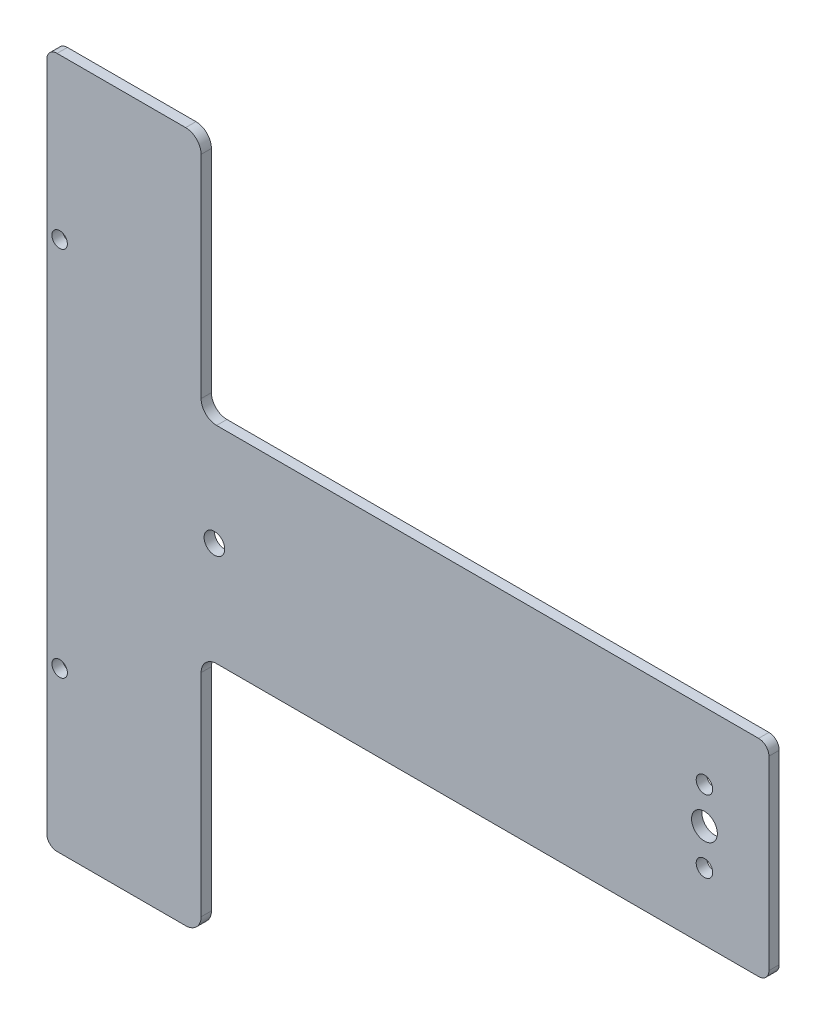
ISO-10303-21;
HEADER;
FILE_DESCRIPTION(('STEP AP214'),'2;1');
FILE_NAME('part.step','',(''),(''),'','','');
FILE_SCHEMA(('AUTOMOTIVE_DESIGN { 1 0 10303 214 1 1 1 1 }'));
ENDSEC;
DATA;
#1=APPLICATION_CONTEXT('core data for automotive mechanical design processes');
#2=APPLICATION_PROTOCOL_DEFINITION('international standard','automotive_design',2000,#1);
#3=PRODUCT_CONTEXT('',#1,'mechanical');
#4=PRODUCT('Part','Part','',(#3));
#5=PRODUCT_RELATED_PRODUCT_CATEGORY('part','',(#4));
#6=PRODUCT_DEFINITION_FORMATION('','',#4);
#7=PRODUCT_DEFINITION_CONTEXT('part definition',#1,'design');
#8=PRODUCT_DEFINITION('design','',#6,#7);
#9=PRODUCT_DEFINITION_SHAPE('','',#8);
#10=(LENGTH_UNIT() NAMED_UNIT(*) SI_UNIT(.MILLI.,.METRE.));
#11=(NAMED_UNIT(*) PLANE_ANGLE_UNIT() SI_UNIT($,.RADIAN.));
#12=(NAMED_UNIT(*) SI_UNIT($,.STERADIAN.) SOLID_ANGLE_UNIT());
#13=UNCERTAINTY_MEASURE_WITH_UNIT(LENGTH_MEASURE(1.E-05),#10,'distance_accuracy_value','');
#14=(GEOMETRIC_REPRESENTATION_CONTEXT(3) GLOBAL_UNCERTAINTY_ASSIGNED_CONTEXT((#13)) GLOBAL_UNIT_ASSIGNED_CONTEXT((#10,
#11,#12)) REPRESENTATION_CONTEXT('',''));
#15=CARTESIAN_POINT('',(0.,0.,0.));
#16=DIRECTION('',(0.,0.,1.));
#17=DIRECTION('',(1.,0.,0.));
#18=AXIS2_PLACEMENT_3D('',#15,#16,#17);
#19=CARTESIAN_POINT('',(84.0783787460964,65.,47.6560709105095));
#20=DIRECTION('',(0.,0.,-1.));
#21=DIRECTION('',(-1.,0.,0.));
#22=AXIS2_PLACEMENT_3D('',#19,#20,#21);
#23=CYLINDRICAL_SURFACE('',#22,2.);
#24=CARTESIAN_POINT('',(84.0783787460964,65.,45.6560709105095));
#25=DIRECTION('',(0.,0.,1.));
#26=DIRECTION('',(1.,0.,0.));
#27=AXIS2_PLACEMENT_3D('',#24,#25,#26);
#28=CIRCLE('',#27,2.);
#29=CARTESIAN_POINT('',(84.0783787460964,67.,45.6560709105095));
#30=VERTEX_POINT('',#29);
#31=CARTESIAN_POINT('',(82.0783787460964,65.,45.6560709105095));
#32=VERTEX_POINT('',#31);
#33=EDGE_CURVE('E198',#30,#32,#28,.T.);
#34=ORIENTED_EDGE('',*,*,#33,.T.);
#35=DIRECTION('',(0.,0.,-1.));
#36=VECTOR('',#35,1.);
#37=CARTESIAN_POINT('',(82.0783787460964,65.,47.6560709105095));
#38=LINE('',#37,#36);
#39=CARTESIAN_POINT('',(82.0783787460964,65.,47.6560709105095));
#40=VERTEX_POINT('',#39);
#41=EDGE_CURVE('E11',#40,#32,#38,.T.);
#42=ORIENTED_EDGE('',*,*,#41,.F.);
#43=CARTESIAN_POINT('',(84.0783787460964,65.,47.6560709105095));
#44=DIRECTION('',(0.,0.,1.));
#45=DIRECTION('',(1.,0.,0.));
#46=AXIS2_PLACEMENT_3D('',#43,#44,#45);
#47=CIRCLE('',#46,2.);
#48=CARTESIAN_POINT('',(84.0783787460964,67.,47.6560709105095));
#49=VERTEX_POINT('',#48);
#50=EDGE_CURVE('E245',#49,#40,#47,.T.);
#51=ORIENTED_EDGE('',*,*,#50,.F.);
#52=DIRECTION('',(0.,0.,-1.));
#53=VECTOR('',#52,1.);
#54=CARTESIAN_POINT('',(84.0783787460964,67.,47.6560709105095));
#55=LINE('',#54,#53);
#56=EDGE_CURVE('E194',#49,#30,#55,.T.);
#57=ORIENTED_EDGE('',*,*,#56,.T.);
#58=EDGE_LOOP('',(#34,#42,#51,#57));
#59=FACE_BOUND('',#58,.T.);
#60=ADVANCED_FACE('F47',(#59),#23,.T.);
#61=CARTESIAN_POINT('',(82.0783787460964,65.,47.6560709105095));
#62=DIRECTION('',(1.,0.,0.));
#63=DIRECTION('',(0.,0.,-1.));
#64=AXIS2_PLACEMENT_3D('',#61,#62,#63);
#65=PLANE('',#64);
#66=DIRECTION('',(0.,-1.,0.));
#67=VECTOR('',#66,1.);
#68=CARTESIAN_POINT('',(82.0783787460964,65.,45.6560709105095));
#69=LINE('',#68,#67);
#70=CARTESIAN_POINT('',(82.0783787460964,-65.,45.6560709105095));
#71=VERTEX_POINT('',#70);
#72=EDGE_CURVE('E202',#32,#71,#69,.T.);
#73=ORIENTED_EDGE('',*,*,#72,.T.);
#74=DIRECTION('',(0.,0.,-1.));
#75=VECTOR('',#74,1.);
#76=CARTESIAN_POINT('',(82.0783787460964,-65.,47.6560709105095));
#77=LINE('',#76,#75);
#78=CARTESIAN_POINT('',(82.0783787460964,-65.,47.6560709105095));
#79=VERTEX_POINT('',#78);
#80=EDGE_CURVE('E56',#79,#71,#77,.T.);
#81=ORIENTED_EDGE('',*,*,#80,.F.);
#82=DIRECTION('',(0.,-1.,0.));
#83=VECTOR('',#82,1.);
#84=CARTESIAN_POINT('',(82.0783787460964,65.,47.6560709105095));
#85=LINE('',#84,#83);
#86=EDGE_CURVE('E131',#40,#79,#85,.T.);
#87=ORIENTED_EDGE('',*,*,#86,.F.);
#88=ORIENTED_EDGE('',*,*,#41,.T.);
#89=EDGE_LOOP('',(#73,#81,#87,#88));
#90=FACE_BOUND('',#89,.T.);
#91=ADVANCED_FACE('F394',(#90),#65,.F.);
#92=CARTESIAN_POINT('',(84.0783787460964,-65.,47.6560709105095));
#93=DIRECTION('',(0.,0.,-1.));
#94=DIRECTION('',(-1.,0.,0.));
#95=AXIS2_PLACEMENT_3D('',#92,#93,#94);
#96=CYLINDRICAL_SURFACE('',#95,2.);
#97=CARTESIAN_POINT('',(84.0783787460964,-65.,45.6560709105095));
#98=DIRECTION('',(0.,0.,1.));
#99=DIRECTION('',(1.,0.,0.));
#100=AXIS2_PLACEMENT_3D('',#97,#98,#99);
#101=CIRCLE('',#100,2.);
#102=CARTESIAN_POINT('',(84.0783787460964,-67.,45.6560709105095));
#103=VERTEX_POINT('',#102);
#104=EDGE_CURVE('E206',#71,#103,#101,.T.);
#105=ORIENTED_EDGE('',*,*,#104,.T.);
#106=DIRECTION('',(0.,0.,-1.));
#107=VECTOR('',#106,1.);
#108=CARTESIAN_POINT('',(84.0783787460964,-67.,47.6560709105095));
#109=LINE('',#108,#107);
#110=CARTESIAN_POINT('',(84.0783787460964,-67.,47.6560709105095));
#111=VERTEX_POINT('',#110);
#112=EDGE_CURVE('E288',#111,#103,#109,.T.);
#113=ORIENTED_EDGE('',*,*,#112,.F.);
#114=CARTESIAN_POINT('',(84.0783787460964,-65.,47.6560709105095));
#115=DIRECTION('',(0.,0.,1.));
#116=DIRECTION('',(1.,0.,0.));
#117=AXIS2_PLACEMENT_3D('',#114,#115,#116);
#118=CIRCLE('',#117,2.);
#119=EDGE_CURVE('E300',#79,#111,#118,.T.);
#120=ORIENTED_EDGE('',*,*,#119,.F.);
#121=ORIENTED_EDGE('',*,*,#80,.T.);
#122=EDGE_LOOP('',(#105,#113,#120,#121));
#123=FACE_BOUND('',#122,.T.);
#124=ADVANCED_FACE('F298',(#123),#96,.T.);
#125=CARTESIAN_POINT('',(84.0783787460964,-67.,47.6560709105095));
#126=DIRECTION('',(0.,1.,0.));
#127=DIRECTION('',(0.,0.,1.));
#128=AXIS2_PLACEMENT_3D('',#125,#126,#127);
#129=PLANE('',#128);
#130=DIRECTION('',(1.,0.,0.));
#131=VECTOR('',#130,1.);
#132=CARTESIAN_POINT('',(84.0783787460964,-67.,45.6560709105095));
#133=LINE('',#132,#131);
#134=CARTESIAN_POINT('',(109.,-67.,45.6560709105095));
#135=VERTEX_POINT('',#134);
#136=EDGE_CURVE('E209',#103,#135,#133,.T.);
#137=ORIENTED_EDGE('',*,*,#136,.T.);
#138=DIRECTION('',(0.,0.,-1.));
#139=VECTOR('',#138,1.);
#140=CARTESIAN_POINT('',(109.,-67.,47.6560709105095));
#141=LINE('',#140,#139);
#142=CARTESIAN_POINT('',(109.,-67.,47.6560709105095));
#143=VERTEX_POINT('',#142);
#144=EDGE_CURVE('E284',#143,#135,#141,.T.);
#145=ORIENTED_EDGE('',*,*,#144,.F.);
#146=DIRECTION('',(1.,0.,0.));
#147=VECTOR('',#146,1.);
#148=CARTESIAN_POINT('',(84.0783787460964,-67.,47.6560709105095));
#149=LINE('',#148,#147);
#150=EDGE_CURVE('E319',#111,#143,#149,.T.);
#151=ORIENTED_EDGE('',*,*,#150,.F.);
#152=ORIENTED_EDGE('',*,*,#112,.T.);
#153=EDGE_LOOP('',(#137,#145,#151,#152));
#154=FACE_BOUND('',#153,.T.);
#155=ADVANCED_FACE('F309',(#154),#129,.F.);
#156=CARTESIAN_POINT('',(109.,-64.,47.6560709105095));
#157=DIRECTION('',(0.,0.,-1.));
#158=DIRECTION('',(-1.,0.,0.));
#159=AXIS2_PLACEMENT_3D('',#156,#157,#158);
#160=CYLINDRICAL_SURFACE('',#159,3.);
#161=CARTESIAN_POINT('',(109.,-64.,45.6560709105095));
#162=DIRECTION('',(0.,0.,1.));
#163=DIRECTION('',(1.,0.,0.));
#164=AXIS2_PLACEMENT_3D('',#161,#162,#163);
#165=CIRCLE('',#164,3.);
#166=CARTESIAN_POINT('',(112.,-64.,45.6560709105095));
#167=VERTEX_POINT('',#166);
#168=EDGE_CURVE('E212',#135,#167,#165,.T.);
#169=ORIENTED_EDGE('',*,*,#168,.T.);
#170=DIRECTION('',(0.,0.,-1.));
#171=VECTOR('',#170,1.);
#172=CARTESIAN_POINT('',(112.,-64.,47.6560709105095));
#173=LINE('',#172,#171);
#174=CARTESIAN_POINT('',(112.,-64.,47.6560709105095));
#175=VERTEX_POINT('',#174);
#176=EDGE_CURVE('E280',#175,#167,#173,.T.);
#177=ORIENTED_EDGE('',*,*,#176,.F.);
#178=CARTESIAN_POINT('',(109.,-64.,47.6560709105095));
#179=DIRECTION('',(0.,0.,1.));
#180=DIRECTION('',(1.,0.,0.));
#181=AXIS2_PLACEMENT_3D('',#178,#179,#180);
#182=CIRCLE('',#181,3.);
#183=EDGE_CURVE('E315',#143,#175,#182,.T.);
#184=ORIENTED_EDGE('',*,*,#183,.F.);
#185=ORIENTED_EDGE('',*,*,#144,.T.);
#186=EDGE_LOOP('',(#169,#177,#184,#185));
#187=FACE_BOUND('',#186,.T.);
#188=ADVANCED_FACE('F313',(#187),#160,.T.);
#189=CARTESIAN_POINT('',(112.,-64.,47.6560709105095));
#190=DIRECTION('',(-1.,0.,0.));
#191=DIRECTION('',(0.,0.,1.));
#192=AXIS2_PLACEMENT_3D('',#189,#190,#191);
#193=PLANE('',#192);
#194=DIRECTION('',(0.,1.,0.));
#195=VECTOR('',#194,1.);
#196=CARTESIAN_POINT('',(112.,-64.,45.6560709105095));
#197=LINE('',#196,#195);
#198=CARTESIAN_POINT('',(112.,-23.,45.6560709105095));
#199=VERTEX_POINT('',#198);
#200=EDGE_CURVE('E215',#167,#199,#197,.T.);
#201=ORIENTED_EDGE('',*,*,#200,.T.);
#202=DIRECTION('',(0.,0.,-1.));
#203=VECTOR('',#202,1.);
#204=CARTESIAN_POINT('',(112.,-23.,47.6560709105095));
#205=LINE('',#204,#203);
#206=CARTESIAN_POINT('',(112.,-23.,47.6560709105095));
#207=VERTEX_POINT('',#206);
#208=EDGE_CURVE('E276',#207,#199,#205,.T.);
#209=ORIENTED_EDGE('',*,*,#208,.F.);
#210=DIRECTION('',(0.,1.,0.));
#211=VECTOR('',#210,1.);
#212=CARTESIAN_POINT('',(112.,-64.,47.6560709105095));
#213=LINE('',#212,#211);
#214=EDGE_CURVE('E318',#175,#207,#213,.T.);
#215=ORIENTED_EDGE('',*,*,#214,.F.);
#216=ORIENTED_EDGE('',*,*,#176,.T.);
#217=EDGE_LOOP('',(#201,#209,#215,#216));
#218=FACE_BOUND('',#217,.T.);
#219=ADVANCED_FACE('F405',(#218),#193,.F.);
#220=CARTESIAN_POINT('',(115.,-23.,47.6560709105095));
#221=DIRECTION('',(0.,0.,-1.));
#222=DIRECTION('',(-1.,0.,0.));
#223=AXIS2_PLACEMENT_3D('',#220,#221,#222);
#224=CYLINDRICAL_SURFACE('',#223,3.);
#225=CARTESIAN_POINT('',(115.,-23.,45.6560709105095));
#226=DIRECTION('',(0.,0.,-1.));
#227=DIRECTION('',(-1.,0.,0.));
#228=AXIS2_PLACEMENT_3D('',#225,#226,#227);
#229=CIRCLE('',#228,3.);
#230=CARTESIAN_POINT('',(115.,-20.,45.6560709105095));
#231=VERTEX_POINT('',#230);
#232=EDGE_CURVE('E218',#199,#231,#229,.T.);
#233=ORIENTED_EDGE('',*,*,#232,.T.);
#234=DIRECTION('',(0.,0.,-1.));
#235=VECTOR('',#234,1.);
#236=CARTESIAN_POINT('',(115.,-20.,47.6560709105095));
#237=LINE('',#236,#235);
#238=CARTESIAN_POINT('',(115.,-20.,47.6560709105095));
#239=VERTEX_POINT('',#238);
#240=EDGE_CURVE('E272',#239,#231,#237,.T.);
#241=ORIENTED_EDGE('',*,*,#240,.F.);
#242=CARTESIAN_POINT('',(115.,-23.,47.6560709105095));
#243=DIRECTION('',(0.,0.,-1.));
#244=DIRECTION('',(-1.,0.,0.));
#245=AXIS2_PLACEMENT_3D('',#242,#243,#244);
#246=CIRCLE('',#245,3.);
#247=EDGE_CURVE('E322',#207,#239,#246,.T.);
#248=ORIENTED_EDGE('',*,*,#247,.F.);
#249=ORIENTED_EDGE('',*,*,#208,.T.);
#250=EDGE_LOOP('',(#233,#241,#248,#249));
#251=FACE_BOUND('',#250,.T.);
#252=ADVANCED_FACE('F408',(#251),#224,.F.);
#253=CARTESIAN_POINT('',(115.,-20.,47.6560709105095));
#254=DIRECTION('',(0.,1.,0.));
#255=DIRECTION('',(0.,0.,1.));
#256=AXIS2_PLACEMENT_3D('',#253,#254,#255);
#257=PLANE('',#256);
#258=DIRECTION('',(1.,0.,0.));
#259=VECTOR('',#258,1.);
#260=CARTESIAN_POINT('',(115.,-20.,45.6560709105095));
#261=LINE('',#260,#259);
#262=CARTESIAN_POINT('',(220.078378746096,-20.,45.6560709105095));
#263=VERTEX_POINT('',#262);
#264=EDGE_CURVE('E221',#231,#263,#261,.T.);
#265=ORIENTED_EDGE('',*,*,#264,.T.);
#266=DIRECTION('',(0.,0.,-1.));
#267=VECTOR('',#266,1.);
#268=CARTESIAN_POINT('',(220.078378746096,-20.,47.6560709105095));
#269=LINE('',#268,#267);
#270=CARTESIAN_POINT('',(220.078378746096,-20.,47.6560709105095));
#271=VERTEX_POINT('',#270);
#272=EDGE_CURVE('E268',#271,#263,#269,.T.);
#273=ORIENTED_EDGE('',*,*,#272,.F.);
#274=DIRECTION('',(1.,0.,0.));
#275=VECTOR('',#274,1.);
#276=CARTESIAN_POINT('',(115.,-20.,47.6560709105095));
#277=LINE('',#276,#275);
#278=EDGE_CURVE('E330',#239,#271,#277,.T.);
#279=ORIENTED_EDGE('',*,*,#278,.F.);
#280=ORIENTED_EDGE('',*,*,#240,.T.);
#281=EDGE_LOOP('',(#265,#273,#279,#280));
#282=FACE_BOUND('',#281,.T.);
#283=ADVANCED_FACE('F412',(#282),#257,.F.);
#284=CARTESIAN_POINT('',(220.078378746096,-18.,47.6560709105095));
#285=DIRECTION('',(0.,0.,-1.));
#286=DIRECTION('',(-1.,0.,0.));
#287=AXIS2_PLACEMENT_3D('',#284,#285,#286);
#288=CYLINDRICAL_SURFACE('',#287,2.);
#289=CARTESIAN_POINT('',(220.078378746096,-18.,45.6560709105095));
#290=DIRECTION('',(0.,0.,1.));
#291=DIRECTION('',(1.,0.,0.));
#292=AXIS2_PLACEMENT_3D('',#289,#290,#291);
#293=CIRCLE('',#292,2.);
#294=CARTESIAN_POINT('',(222.078378746096,-18.,45.6560709105095));
#295=VERTEX_POINT('',#294);
#296=EDGE_CURVE('E224',#263,#295,#293,.T.);
#297=ORIENTED_EDGE('',*,*,#296,.T.);
#298=DIRECTION('',(0.,0.,-1.));
#299=VECTOR('',#298,1.);
#300=CARTESIAN_POINT('',(222.078378746096,-18.,47.6560709105095));
#301=LINE('',#300,#299);
#302=CARTESIAN_POINT('',(222.078378746096,-18.,47.6560709105095));
#303=VERTEX_POINT('',#302);
#304=EDGE_CURVE('E264',#303,#295,#301,.T.);
#305=ORIENTED_EDGE('',*,*,#304,.F.);
#306=CARTESIAN_POINT('',(220.078378746096,-18.,47.6560709105095));
#307=DIRECTION('',(0.,0.,1.));
#308=DIRECTION('',(1.,0.,0.));
#309=AXIS2_PLACEMENT_3D('',#306,#307,#308);
#310=CIRCLE('',#309,2.);
#311=EDGE_CURVE('E332',#271,#303,#310,.T.);
#312=ORIENTED_EDGE('',*,*,#311,.F.);
#313=ORIENTED_EDGE('',*,*,#272,.T.);
#314=EDGE_LOOP('',(#297,#305,#312,#313));
#315=FACE_BOUND('',#314,.T.);
#316=ADVANCED_FACE('F416',(#315),#288,.T.);
#317=CARTESIAN_POINT('',(222.078378746096,-18.,47.6560709105095));
#318=DIRECTION('',(-1.,0.,0.));
#319=DIRECTION('',(0.,0.,1.));
#320=AXIS2_PLACEMENT_3D('',#317,#318,#319);
#321=PLANE('',#320);
#322=DIRECTION('',(0.,1.,0.));
#323=VECTOR('',#322,1.);
#324=CARTESIAN_POINT('',(222.078378746096,-18.,45.6560709105095));
#325=LINE('',#324,#323);
#326=CARTESIAN_POINT('',(222.078378746096,18.,45.6560709105095));
#327=VERTEX_POINT('',#326);
#328=EDGE_CURVE('E227',#295,#327,#325,.T.);
#329=ORIENTED_EDGE('',*,*,#328,.T.);
#330=DIRECTION('',(0.,0.,-1.));
#331=VECTOR('',#330,1.);
#332=CARTESIAN_POINT('',(222.078378746096,18.,47.6560709105095));
#333=LINE('',#332,#331);
#334=CARTESIAN_POINT('',(222.078378746096,18.,47.6560709105095));
#335=VERTEX_POINT('',#334);
#336=EDGE_CURVE('E260',#335,#327,#333,.T.);
#337=ORIENTED_EDGE('',*,*,#336,.F.);
#338=DIRECTION('',(0.,1.,0.));
#339=VECTOR('',#338,1.);
#340=CARTESIAN_POINT('',(222.078378746096,-18.,47.6560709105095));
#341=LINE('',#340,#339);
#342=EDGE_CURVE('E335',#303,#335,#341,.T.);
#343=ORIENTED_EDGE('',*,*,#342,.F.);
#344=ORIENTED_EDGE('',*,*,#304,.T.);
#345=EDGE_LOOP('',(#329,#337,#343,#344));
#346=FACE_BOUND('',#345,.T.);
#347=ADVANCED_FACE('F420',(#346),#321,.F.);
#348=CARTESIAN_POINT('',(220.078378746096,18.,47.6560709105095));
#349=DIRECTION('',(0.,0.,-1.));
#350=DIRECTION('',(-1.,0.,0.));
#351=AXIS2_PLACEMENT_3D('',#348,#349,#350);
#352=CYLINDRICAL_SURFACE('',#351,2.);
#353=CARTESIAN_POINT('',(220.078378746096,18.,45.6560709105095));
#354=DIRECTION('',(0.,0.,1.));
#355=DIRECTION('',(1.,0.,0.));
#356=AXIS2_PLACEMENT_3D('',#353,#354,#355);
#357=CIRCLE('',#356,2.);
#358=CARTESIAN_POINT('',(220.078378746096,20.,45.6560709105095));
#359=VERTEX_POINT('',#358);
#360=EDGE_CURVE('E230',#327,#359,#357,.T.);
#361=ORIENTED_EDGE('',*,*,#360,.T.);
#362=DIRECTION('',(0.,0.,-1.));
#363=VECTOR('',#362,1.);
#364=CARTESIAN_POINT('',(220.078378746096,20.,47.6560709105095));
#365=LINE('',#364,#363);
#366=CARTESIAN_POINT('',(220.078378746096,20.,47.6560709105095));
#367=VERTEX_POINT('',#366);
#368=EDGE_CURVE('E256',#367,#359,#365,.T.);
#369=ORIENTED_EDGE('',*,*,#368,.F.);
#370=CARTESIAN_POINT('',(220.078378746096,18.,47.6560709105095));
#371=DIRECTION('',(0.,0.,1.));
#372=DIRECTION('',(1.,0.,0.));
#373=AXIS2_PLACEMENT_3D('',#370,#371,#372);
#374=CIRCLE('',#373,2.);
#375=EDGE_CURVE('E338',#335,#367,#374,.T.);
#376=ORIENTED_EDGE('',*,*,#375,.F.);
#377=ORIENTED_EDGE('',*,*,#336,.T.);
#378=EDGE_LOOP('',(#361,#369,#376,#377));
#379=FACE_BOUND('',#378,.T.);
#380=ADVANCED_FACE('F424',(#379),#352,.T.);
#381=CARTESIAN_POINT('',(220.078378746096,20.,47.6560709105095));
#382=DIRECTION('',(0.,-1.,0.));
#383=DIRECTION('',(0.,0.,-1.));
#384=AXIS2_PLACEMENT_3D('',#381,#382,#383);
#385=PLANE('',#384);
#386=DIRECTION('',(-1.,0.,0.));
#387=VECTOR('',#386,1.);
#388=CARTESIAN_POINT('',(220.078378746096,20.,45.6560709105095));
#389=LINE('',#388,#387);
#390=CARTESIAN_POINT('',(115.,20.,45.6560709105095));
#391=VERTEX_POINT('',#390);
#392=EDGE_CURVE('E233',#359,#391,#389,.T.);
#393=ORIENTED_EDGE('',*,*,#392,.T.);
#394=DIRECTION('',(0.,0.,-1.));
#395=VECTOR('',#394,1.);
#396=CARTESIAN_POINT('',(115.,20.,47.6560709105095));
#397=LINE('',#396,#395);
#398=CARTESIAN_POINT('',(115.,20.,47.6560709105095));
#399=VERTEX_POINT('',#398);
#400=EDGE_CURVE('E252',#399,#391,#397,.T.);
#401=ORIENTED_EDGE('',*,*,#400,.F.);
#402=DIRECTION('',(-1.,0.,0.));
#403=VECTOR('',#402,1.);
#404=CARTESIAN_POINT('',(220.078378746096,20.,47.6560709105095));
#405=LINE('',#404,#403);
#406=EDGE_CURVE('E341',#367,#399,#405,.T.);
#407=ORIENTED_EDGE('',*,*,#406,.F.);
#408=ORIENTED_EDGE('',*,*,#368,.T.);
#409=EDGE_LOOP('',(#393,#401,#407,#408));
#410=FACE_BOUND('',#409,.T.);
#411=ADVANCED_FACE('F428',(#410),#385,.F.);
#412=CARTESIAN_POINT('',(115.,23.,47.6560709105095));
#413=DIRECTION('',(0.,0.,-1.));
#414=DIRECTION('',(-1.,0.,0.));
#415=AXIS2_PLACEMENT_3D('',#412,#413,#414);
#416=CYLINDRICAL_SURFACE('',#415,3.);
#417=CARTESIAN_POINT('',(115.,23.,45.6560709105095));
#418=DIRECTION('',(0.,0.,-1.));
#419=DIRECTION('',(-1.,0.,0.));
#420=AXIS2_PLACEMENT_3D('',#417,#418,#419);
#421=CIRCLE('',#420,3.);
#422=CARTESIAN_POINT('',(112.,23.,45.6560709105095));
#423=VERTEX_POINT('',#422);
#424=EDGE_CURVE('E236',#391,#423,#421,.T.);
#425=ORIENTED_EDGE('',*,*,#424,.T.);
#426=DIRECTION('',(0.,0.,-1.));
#427=VECTOR('',#426,1.);
#428=CARTESIAN_POINT('',(112.,23.,47.6560709105095));
#429=LINE('',#428,#427);
#430=CARTESIAN_POINT('',(112.,23.,47.6560709105095));
#431=VERTEX_POINT('',#430);
#432=EDGE_CURVE('E185',#431,#423,#429,.T.);
#433=ORIENTED_EDGE('',*,*,#432,.F.);
#434=CARTESIAN_POINT('',(115.,23.,47.6560709105095));
#435=DIRECTION('',(0.,0.,-1.));
#436=DIRECTION('',(-1.,0.,0.));
#437=AXIS2_PLACEMENT_3D('',#434,#435,#436);
#438=CIRCLE('',#437,3.);
#439=EDGE_CURVE('E174',#399,#431,#438,.T.);
#440=ORIENTED_EDGE('',*,*,#439,.F.);
#441=ORIENTED_EDGE('',*,*,#400,.T.);
#442=EDGE_LOOP('',(#425,#433,#440,#441));
#443=FACE_BOUND('',#442,.T.);
#444=ADVANCED_FACE('F432',(#443),#416,.F.);
#445=CARTESIAN_POINT('',(112.,23.,47.6560709105095));
#446=DIRECTION('',(-1.,0.,0.));
#447=DIRECTION('',(0.,0.,1.));
#448=AXIS2_PLACEMENT_3D('',#445,#446,#447);
#449=PLANE('',#448);
#450=DIRECTION('',(0.,1.,0.));
#451=VECTOR('',#450,1.);
#452=CARTESIAN_POINT('',(112.,23.,45.6560709105095));
#453=LINE('',#452,#451);
#454=CARTESIAN_POINT('',(112.,64.,45.6560709105095));
#455=VERTEX_POINT('',#454);
#456=EDGE_CURVE('E183',#423,#455,#453,.T.);
#457=ORIENTED_EDGE('',*,*,#456,.T.);
#458=DIRECTION('',(0.,0.,-1.));
#459=VECTOR('',#458,1.);
#460=CARTESIAN_POINT('',(112.,64.,47.6560709105095));
#461=LINE('',#460,#459);
#462=CARTESIAN_POINT('',(112.,64.,47.6560709105095));
#463=VERTEX_POINT('',#462);
#464=EDGE_CURVE('E180',#463,#455,#461,.T.);
#465=ORIENTED_EDGE('',*,*,#464,.F.);
#466=DIRECTION('',(0.,1.,0.));
#467=VECTOR('',#466,1.);
#468=CARTESIAN_POINT('',(112.,23.,47.6560709105095));
#469=LINE('',#468,#467);
#470=EDGE_CURVE('E168',#431,#463,#469,.T.);
#471=ORIENTED_EDGE('',*,*,#470,.F.);
#472=ORIENTED_EDGE('',*,*,#432,.T.);
#473=EDGE_LOOP('',(#457,#465,#471,#472));
#474=FACE_BOUND('',#473,.T.);
#475=ADVANCED_FACE('F181',(#474),#449,.F.);
#476=CARTESIAN_POINT('',(109.,64.,47.6560709105095));
#477=DIRECTION('',(0.,0.,-1.));
#478=DIRECTION('',(-1.,0.,0.));
#479=AXIS2_PLACEMENT_3D('',#476,#477,#478);
#480=CYLINDRICAL_SURFACE('',#479,3.);
#481=CARTESIAN_POINT('',(109.,64.,45.6560709105095));
#482=DIRECTION('',(0.,0.,1.));
#483=DIRECTION('',(1.,0.,0.));
#484=AXIS2_PLACEMENT_3D('',#481,#482,#483);
#485=CIRCLE('',#484,3.);
#486=CARTESIAN_POINT('',(109.,67.,45.6560709105095));
#487=VERTEX_POINT('',#486);
#488=EDGE_CURVE('E117',#455,#487,#485,.T.);
#489=ORIENTED_EDGE('',*,*,#488,.T.);
#490=DIRECTION('',(0.,0.,-1.));
#491=VECTOR('',#490,1.);
#492=CARTESIAN_POINT('',(109.,67.,47.6560709105095));
#493=LINE('',#492,#491);
#494=CARTESIAN_POINT('',(109.,67.,47.6560709105095));
#495=VERTEX_POINT('',#494);
#496=EDGE_CURVE('E186',#495,#487,#493,.T.);
#497=ORIENTED_EDGE('',*,*,#496,.F.);
#498=CARTESIAN_POINT('',(109.,64.,47.6560709105095));
#499=DIRECTION('',(0.,0.,1.));
#500=DIRECTION('',(1.,0.,0.));
#501=AXIS2_PLACEMENT_3D('',#498,#499,#500);
#502=CIRCLE('',#501,3.);
#503=EDGE_CURVE('E172',#463,#495,#502,.T.);
#504=ORIENTED_EDGE('',*,*,#503,.F.);
#505=ORIENTED_EDGE('',*,*,#464,.T.);
#506=EDGE_LOOP('',(#489,#497,#504,#505));
#507=FACE_BOUND('',#506,.T.);
#508=ADVANCED_FACE('F188',(#507),#480,.T.);
#509=CARTESIAN_POINT('',(109.,67.,47.6560709105095));
#510=DIRECTION('',(0.,-1.,0.));
#511=DIRECTION('',(0.,0.,-1.));
#512=AXIS2_PLACEMENT_3D('',#509,#510,#511);
#513=PLANE('',#512);
#514=DIRECTION('',(-1.,0.,0.));
#515=VECTOR('',#514,1.);
#516=CARTESIAN_POINT('',(109.,67.,45.6560709105095));
#517=LINE('',#516,#515);
#518=EDGE_CURVE('E123',#487,#30,#517,.T.);
#519=ORIENTED_EDGE('',*,*,#518,.T.);
#520=ORIENTED_EDGE('',*,*,#56,.F.);
#521=DIRECTION('',(-1.,0.,0.));
#522=VECTOR('',#521,1.);
#523=CARTESIAN_POINT('',(109.,67.,47.6560709105095));
#524=LINE('',#523,#522);
#525=EDGE_CURVE('E64',#495,#49,#524,.T.);
#526=ORIENTED_EDGE('',*,*,#525,.F.);
#527=ORIENTED_EDGE('',*,*,#496,.T.);
#528=EDGE_LOOP('',(#519,#520,#526,#527));
#529=FACE_BOUND('',#528,.T.);
#530=ADVANCED_FACE('F441',(#529),#513,.F.);
#531=CARTESIAN_POINT('',(84.0783787460964,65.,47.6560709105095));
#532=DIRECTION('',(0.,0.,1.));
#533=DIRECTION('',(1.,0.,0.));
#534=AXIS2_PLACEMENT_3D('',#531,#532,#533);
#535=PLANE('',#534);
#536=CARTESIAN_POINT('',(209.57858663,-7.,47.6560709105095));
#537=DIRECTION('',(0.,0.,1.));
#538=DIRECTION('',(1.,0.,0.));
#539=AXIS2_PLACEMENT_3D('',#536,#537,#538);
#540=CIRCLE('',#539,1.59999999999999);
#541=CARTESIAN_POINT('',(211.17858663,-7.,47.6560709105095));
#542=VERTEX_POINT('',#541);
#543=EDGE_CURVE('E386',#542,#542,#540,.T.);
#544=ORIENTED_EDGE('',*,*,#543,.F.);
#545=EDGE_LOOP('',(#544));
#546=FACE_BOUND('',#545,.T.);
#547=CARTESIAN_POINT('',(209.57858663,7.,47.6560709105095));
#548=DIRECTION('',(0.,0.,1.));
#549=DIRECTION('',(1.,0.,0.));
#550=AXIS2_PLACEMENT_3D('',#547,#548,#549);
#551=CIRCLE('',#550,1.59999999999999);
#552=CARTESIAN_POINT('',(211.17858663,7.,47.6560709105095));
#553=VERTEX_POINT('',#552);
#554=EDGE_CURVE('E351',#553,#553,#551,.T.);
#555=ORIENTED_EDGE('',*,*,#554,.F.);
#556=EDGE_LOOP('',(#555));
#557=FACE_BOUND('',#556,.T.);
#558=CARTESIAN_POINT('',(209.578378746096,0.,47.6560709105095));
#559=DIRECTION('',(0.,0.,1.));
#560=DIRECTION('',(1.,0.,0.));
#561=AXIS2_PLACEMENT_3D('',#558,#559,#560);
#562=CIRCLE('',#561,2.5);
#563=CARTESIAN_POINT('',(212.078378746096,0.,47.6560709105095));
#564=VERTEX_POINT('',#563);
#565=EDGE_CURVE('E203',#564,#564,#562,.T.);
#566=ORIENTED_EDGE('',*,*,#565,.F.);
#567=EDGE_LOOP('',(#566));
#568=FACE_BOUND('',#567,.T.);
#569=CARTESIAN_POINT('',(114.578378746096,0.,47.6560709105095));
#570=DIRECTION('',(0.,0.,1.));
#571=DIRECTION('',(1.,0.,0.));
#572=AXIS2_PLACEMENT_3D('',#569,#570,#571);
#573=CIRCLE('',#572,2.);
#574=CARTESIAN_POINT('',(116.578378746096,0.,47.6560709105095));
#575=VERTEX_POINT('',#574);
#576=EDGE_CURVE('E346',#575,#575,#573,.T.);
#577=ORIENTED_EDGE('',*,*,#576,.F.);
#578=EDGE_LOOP('',(#577));
#579=FACE_BOUND('',#578,.T.);
#580=CARTESIAN_POINT('',(84.5783787460964,-36.,47.6560709105095));
#581=DIRECTION('',(0.,0.,1.));
#582=DIRECTION('',(1.,0.,0.));
#583=AXIS2_PLACEMENT_3D('',#580,#581,#582);
#584=CIRCLE('',#583,1.5);
#585=CARTESIAN_POINT('',(86.0783787460964,-36.,47.6560709105095));
#586=VERTEX_POINT('',#585);
#587=EDGE_CURVE('E375',#586,#586,#584,.T.);
#588=ORIENTED_EDGE('',*,*,#587,.F.);
#589=EDGE_LOOP('',(#588));
#590=FACE_BOUND('',#589,.T.);
#591=CARTESIAN_POINT('',(84.5783787460964,36.,47.6560709105095));
#592=DIRECTION('',(0.,0.,1.));
#593=DIRECTION('',(1.,0.,0.));
#594=AXIS2_PLACEMENT_3D('',#591,#592,#593);
#595=CIRCLE('',#594,1.5);
#596=CARTESIAN_POINT('',(86.0783787460964,36.,47.6560709105095));
#597=VERTEX_POINT('',#596);
#598=EDGE_CURVE('E382',#597,#597,#595,.T.);
#599=ORIENTED_EDGE('',*,*,#598,.F.);
#600=EDGE_LOOP('',(#599));
#601=FACE_BOUND('',#600,.T.);
#602=ORIENTED_EDGE('',*,*,#50,.T.);
#603=ORIENTED_EDGE('',*,*,#86,.T.);
#604=ORIENTED_EDGE('',*,*,#119,.T.);
#605=ORIENTED_EDGE('',*,*,#150,.T.);
#606=ORIENTED_EDGE('',*,*,#183,.T.);
#607=ORIENTED_EDGE('',*,*,#214,.T.);
#608=ORIENTED_EDGE('',*,*,#247,.T.);
#609=ORIENTED_EDGE('',*,*,#278,.T.);
#610=ORIENTED_EDGE('',*,*,#311,.T.);
#611=ORIENTED_EDGE('',*,*,#342,.T.);
#612=ORIENTED_EDGE('',*,*,#375,.T.);
#613=ORIENTED_EDGE('',*,*,#406,.T.);
#614=ORIENTED_EDGE('',*,*,#439,.T.);
#615=ORIENTED_EDGE('',*,*,#470,.T.);
#616=ORIENTED_EDGE('',*,*,#503,.T.);
#617=ORIENTED_EDGE('',*,*,#525,.T.);
#618=EDGE_LOOP('',(#602,#603,#604,#605,#606,#607,#608,#609,#610,#611,#612,#613,#614,#615,#616,#617));
#619=FACE_BOUND('',#618,.T.);
#620=ADVANCED_FACE('F170',(#546,#557,#568,#579,#590,#601,#619),#535,.T.);
#621=CARTESIAN_POINT('',(84.0783787460964,65.,45.6560709105095));
#622=DIRECTION('',(0.,0.,1.));
#623=DIRECTION('',(1.,0.,0.));
#624=AXIS2_PLACEMENT_3D('',#621,#622,#623);
#625=PLANE('',#624);
#626=CARTESIAN_POINT('',(209.57858663,-7.,45.6560709105095));
#627=DIRECTION('',(0.,0.,1.));
#628=DIRECTION('',(1.,0.,0.));
#629=AXIS2_PLACEMENT_3D('',#626,#627,#628);
#630=CIRCLE('',#629,1.59999999999999);
#631=CARTESIAN_POINT('',(211.17858663,-7.,45.6560709105095));
#632=VERTEX_POINT('',#631);
#633=EDGE_CURVE('E359',#632,#632,#630,.T.);
#634=ORIENTED_EDGE('',*,*,#633,.T.);
#635=EDGE_LOOP('',(#634));
#636=FACE_BOUND('',#635,.T.);
#637=CARTESIAN_POINT('',(209.57858663,7.,45.6560709105095));
#638=DIRECTION('',(0.,0.,1.));
#639=DIRECTION('',(1.,0.,0.));
#640=AXIS2_PLACEMENT_3D('',#637,#638,#639);
#641=CIRCLE('',#640,1.59999999999999);
#642=CARTESIAN_POINT('',(211.17858663,7.,45.6560709105095));
#643=VERTEX_POINT('',#642);
#644=EDGE_CURVE('E353',#643,#643,#641,.T.);
#645=ORIENTED_EDGE('',*,*,#644,.T.);
#646=EDGE_LOOP('',(#645));
#647=FACE_BOUND('',#646,.T.);
#648=CARTESIAN_POINT('',(209.578378746096,0.,45.6560709105095));
#649=DIRECTION('',(0.,0.,1.));
#650=DIRECTION('',(1.,0.,0.));
#651=AXIS2_PLACEMENT_3D('',#648,#649,#650);
#652=CIRCLE('',#651,2.5);
#653=CARTESIAN_POINT('',(212.078378746096,0.,45.6560709105095));
#654=VERTEX_POINT('',#653);
#655=EDGE_CURVE('E366',#654,#654,#652,.T.);
#656=ORIENTED_EDGE('',*,*,#655,.T.);
#657=EDGE_LOOP('',(#656));
#658=FACE_BOUND('',#657,.T.);
#659=CARTESIAN_POINT('',(114.578378746096,0.,45.6560709105095));
#660=DIRECTION('',(0.,0.,1.));
#661=DIRECTION('',(1.,0.,0.));
#662=AXIS2_PLACEMENT_3D('',#659,#660,#661);
#663=CIRCLE('',#662,2.);
#664=CARTESIAN_POINT('',(116.578378746096,0.,45.6560709105095));
#665=VERTEX_POINT('',#664);
#666=EDGE_CURVE('E344',#665,#665,#663,.T.);
#667=ORIENTED_EDGE('',*,*,#666,.T.);
#668=EDGE_LOOP('',(#667));
#669=FACE_BOUND('',#668,.T.);
#670=CARTESIAN_POINT('',(84.5783787460964,-36.,45.6560709105095));
#671=DIRECTION('',(0.,0.,1.));
#672=DIRECTION('',(1.,0.,0.));
#673=AXIS2_PLACEMENT_3D('',#670,#671,#672);
#674=CIRCLE('',#673,1.5);
#675=CARTESIAN_POINT('',(86.0783787460964,-36.,45.6560709105095));
#676=VERTEX_POINT('',#675);
#677=EDGE_CURVE('E348',#676,#676,#674,.T.);
#678=ORIENTED_EDGE('',*,*,#677,.T.);
#679=EDGE_LOOP('',(#678));
#680=FACE_BOUND('',#679,.T.);
#681=CARTESIAN_POINT('',(84.5783787460964,36.,45.6560709105095));
#682=DIRECTION('',(0.,0.,1.));
#683=DIRECTION('',(1.,0.,0.));
#684=AXIS2_PLACEMENT_3D('',#681,#682,#683);
#685=CIRCLE('',#684,1.5);
#686=CARTESIAN_POINT('',(86.0783787460964,36.,45.6560709105095));
#687=VERTEX_POINT('',#686);
#688=EDGE_CURVE('E379',#687,#687,#685,.T.);
#689=ORIENTED_EDGE('',*,*,#688,.T.);
#690=EDGE_LOOP('',(#689));
#691=FACE_BOUND('',#690,.T.);
#692=ORIENTED_EDGE('',*,*,#33,.F.);
#693=ORIENTED_EDGE('',*,*,#518,.F.);
#694=ORIENTED_EDGE('',*,*,#488,.F.);
#695=ORIENTED_EDGE('',*,*,#456,.F.);
#696=ORIENTED_EDGE('',*,*,#424,.F.);
#697=ORIENTED_EDGE('',*,*,#392,.F.);
#698=ORIENTED_EDGE('',*,*,#360,.F.);
#699=ORIENTED_EDGE('',*,*,#328,.F.);
#700=ORIENTED_EDGE('',*,*,#296,.F.);
#701=ORIENTED_EDGE('',*,*,#264,.F.);
#702=ORIENTED_EDGE('',*,*,#232,.F.);
#703=ORIENTED_EDGE('',*,*,#200,.F.);
#704=ORIENTED_EDGE('',*,*,#168,.F.);
#705=ORIENTED_EDGE('',*,*,#136,.F.);
#706=ORIENTED_EDGE('',*,*,#104,.F.);
#707=ORIENTED_EDGE('',*,*,#72,.F.);
#708=EDGE_LOOP('',(#692,#693,#694,#695,#696,#697,#698,#699,#700,#701,#702,#703,#704,#705,#706,#707));
#709=FACE_BOUND('',#708,.T.);
#710=ADVANCED_FACE('F304',(#636,#647,#658,#669,#680,#691,#709),#625,.F.);
#711=CARTESIAN_POINT('',(84.5783787460964,36.,47.6560709105095));
#712=DIRECTION('',(0.,0.,-1.));
#713=DIRECTION('',(-1.,0.,0.));
#714=AXIS2_PLACEMENT_3D('',#711,#712,#713);
#715=CYLINDRICAL_SURFACE('',#714,1.5);
#716=ORIENTED_EDGE('',*,*,#598,.T.);
#717=EDGE_LOOP('',(#716));
#718=FACE_BOUND('',#717,.T.);
#719=ORIENTED_EDGE('',*,*,#688,.F.);
#720=EDGE_LOOP('',(#719));
#721=FACE_BOUND('',#720,.T.);
#722=ADVANCED_FACE('F446',(#718,#721),#715,.F.);
#723=CARTESIAN_POINT('',(84.5783787460964,-36.,47.6560709105095));
#724=DIRECTION('',(0.,0.,-1.));
#725=DIRECTION('',(-1.,0.,0.));
#726=AXIS2_PLACEMENT_3D('',#723,#724,#725);
#727=CYLINDRICAL_SURFACE('',#726,1.5);
#728=ORIENTED_EDGE('',*,*,#587,.T.);
#729=EDGE_LOOP('',(#728));
#730=FACE_BOUND('',#729,.T.);
#731=ORIENTED_EDGE('',*,*,#677,.F.);
#732=EDGE_LOOP('',(#731));
#733=FACE_BOUND('',#732,.T.);
#734=ADVANCED_FACE('F453',(#730,#733),#727,.F.);
#735=CARTESIAN_POINT('',(114.578378746096,0.,47.6560709105095));
#736=DIRECTION('',(0.,0.,-1.));
#737=DIRECTION('',(-1.,0.,0.));
#738=AXIS2_PLACEMENT_3D('',#735,#736,#737);
#739=CYLINDRICAL_SURFACE('',#738,2.);
#740=ORIENTED_EDGE('',*,*,#576,.T.);
#741=EDGE_LOOP('',(#740));
#742=FACE_BOUND('',#741,.T.);
#743=ORIENTED_EDGE('',*,*,#666,.F.);
#744=EDGE_LOOP('',(#743));
#745=FACE_BOUND('',#744,.T.);
#746=ADVANCED_FACE('F457',(#742,#745),#739,.F.);
#747=CARTESIAN_POINT('',(209.578378746096,0.,47.6560709105095));
#748=DIRECTION('',(0.,0.,-1.));
#749=DIRECTION('',(-1.,0.,0.));
#750=AXIS2_PLACEMENT_3D('',#747,#748,#749);
#751=CYLINDRICAL_SURFACE('',#750,2.5);
#752=ORIENTED_EDGE('',*,*,#565,.T.);
#753=EDGE_LOOP('',(#752));
#754=FACE_BOUND('',#753,.T.);
#755=ORIENTED_EDGE('',*,*,#655,.F.);
#756=EDGE_LOOP('',(#755));
#757=FACE_BOUND('',#756,.T.);
#758=ADVANCED_FACE('F461',(#754,#757),#751,.F.);
#759=CARTESIAN_POINT('',(209.57858663,7.,47.6560709105095));
#760=DIRECTION('',(0.,0.,-1.));
#761=DIRECTION('',(-1.,0.,0.));
#762=AXIS2_PLACEMENT_3D('',#759,#760,#761);
#763=CYLINDRICAL_SURFACE('',#762,1.59999999999999);
#764=ORIENTED_EDGE('',*,*,#554,.T.);
#765=EDGE_LOOP('',(#764));
#766=FACE_BOUND('',#765,.T.);
#767=ORIENTED_EDGE('',*,*,#644,.F.);
#768=EDGE_LOOP('',(#767));
#769=FACE_BOUND('',#768,.T.);
#770=ADVANCED_FACE('F465',(#766,#769),#763,.F.);
#771=CARTESIAN_POINT('',(209.57858663,-7.,47.6560709105095));
#772=DIRECTION('',(0.,0.,-1.));
#773=DIRECTION('',(-1.,0.,0.));
#774=AXIS2_PLACEMENT_3D('',#771,#772,#773);
#775=CYLINDRICAL_SURFACE('',#774,1.59999999999999);
#776=ORIENTED_EDGE('',*,*,#543,.T.);
#777=EDGE_LOOP('',(#776));
#778=FACE_BOUND('',#777,.T.);
#779=ORIENTED_EDGE('',*,*,#633,.F.);
#780=EDGE_LOOP('',(#779));
#781=FACE_BOUND('',#780,.T.);
#782=ADVANCED_FACE('F469',(#778,#781),#775,.F.);
#783=CLOSED_SHELL('',(#60,#91,#124,#155,#188,#219,#252,#283,#316,#347,#380,#411,#444,#475,#508,
#530,#620,#710,#722,#734,#746,#758,#770,#782));
#784=MANIFOLD_SOLID_BREP('B2',#783);
#785=ADVANCED_BREP_SHAPE_REPRESENTATION('',(#18,#784),#14);
#786=SHAPE_DEFINITION_REPRESENTATION(#9,#785);
ENDSEC;
END-ISO-10303-21;
